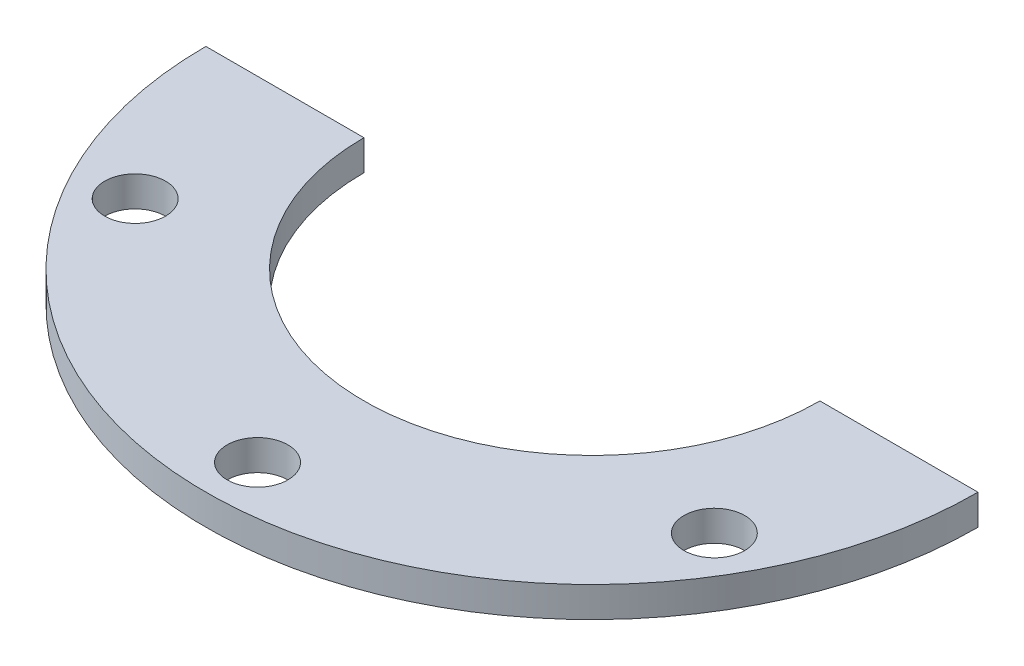
ISO-10303-21;
HEADER;
FILE_DESCRIPTION(('STEP AP214'),'2;1');
FILE_NAME('part.step','',(''),(''),'','','');
FILE_SCHEMA(('AUTOMOTIVE_DESIGN { 1 0 10303 214 1 1 1 1 }'));
ENDSEC;
DATA;
#1=APPLICATION_CONTEXT('core data for automotive mechanical design processes');
#2=APPLICATION_PROTOCOL_DEFINITION('international standard','automotive_design',2000,#1);
#3=PRODUCT_CONTEXT('',#1,'mechanical');
#4=PRODUCT('Part','Part','',(#3));
#5=PRODUCT_RELATED_PRODUCT_CATEGORY('part','',(#4));
#6=PRODUCT_DEFINITION_FORMATION('','',#4);
#7=PRODUCT_DEFINITION_CONTEXT('part definition',#1,'design');
#8=PRODUCT_DEFINITION('design','',#6,#7);
#9=PRODUCT_DEFINITION_SHAPE('','',#8);
#10=(LENGTH_UNIT() NAMED_UNIT(*) SI_UNIT(.MILLI.,.METRE.));
#11=(NAMED_UNIT(*) PLANE_ANGLE_UNIT() SI_UNIT($,.RADIAN.));
#12=(NAMED_UNIT(*) SI_UNIT($,.STERADIAN.) SOLID_ANGLE_UNIT());
#13=UNCERTAINTY_MEASURE_WITH_UNIT(LENGTH_MEASURE(1.E-05),#10,'distance_accuracy_value','');
#14=(GEOMETRIC_REPRESENTATION_CONTEXT(3) GLOBAL_UNCERTAINTY_ASSIGNED_CONTEXT((#13)) GLOBAL_UNIT_ASSIGNED_CONTEXT((#10,
#11,#12)) REPRESENTATION_CONTEXT('',''));
#15=CARTESIAN_POINT('',(0.,0.,0.));
#16=DIRECTION('',(0.,0.,1.));
#17=DIRECTION('',(1.,0.,0.));
#18=AXIS2_PLACEMENT_3D('',#15,#16,#17);
#19=CARTESIAN_POINT('',(0.,1.,0.));
#20=DIRECTION('',(0.,-1.,0.));
#21=DIRECTION('',(0.,0.,-1.));
#22=AXIS2_PLACEMENT_3D('',#19,#20,#21);
#23=CYLINDRICAL_SURFACE('',#22,12.7);
#24=CARTESIAN_POINT('',(0.,1.,0.));
#25=DIRECTION('',(0.,1.,0.));
#26=DIRECTION('',(0.,0.,1.));
#27=AXIS2_PLACEMENT_3D('',#24,#25,#26);
#28=CIRCLE('',#27,12.7);
#29=CARTESIAN_POINT('',(-12.7,1.,0.));
#30=VERTEX_POINT('',#29);
#31=CARTESIAN_POINT('',(12.7,1.,0.));
#32=VERTEX_POINT('',#31);
#33=EDGE_CURVE('E76',#30,#32,#28,.T.);
#34=ORIENTED_EDGE('',*,*,#33,.F.);
#35=DIRECTION('',(0.,-1.,0.));
#36=VECTOR('',#35,1.);
#37=CARTESIAN_POINT('',(-12.7,1.,0.));
#38=LINE('',#37,#36);
#39=CARTESIAN_POINT('',(-12.7,0.,0.));
#40=VERTEX_POINT('',#39);
#41=EDGE_CURVE('E118',#30,#40,#38,.T.);
#42=ORIENTED_EDGE('',*,*,#41,.T.);
#43=CARTESIAN_POINT('',(0.,0.,0.));
#44=DIRECTION('',(0.,1.,0.));
#45=DIRECTION('',(0.,0.,1.));
#46=AXIS2_PLACEMENT_3D('',#43,#44,#45);
#47=CIRCLE('',#46,12.7);
#48=CARTESIAN_POINT('',(12.7,0.,0.));
#49=VERTEX_POINT('',#48);
#50=EDGE_CURVE('E84',#40,#49,#47,.T.);
#51=ORIENTED_EDGE('',*,*,#50,.T.);
#52=DIRECTION('',(0.,-1.,0.));
#53=VECTOR('',#52,1.);
#54=CARTESIAN_POINT('',(12.7,1.,0.));
#55=LINE('',#54,#53);
#56=EDGE_CURVE('E88',#49,#32,#55,.F.);
#57=ORIENTED_EDGE('',*,*,#56,.T.);
#58=EDGE_LOOP('',(#34,#42,#51,#57));
#59=FACE_BOUND('',#58,.T.);
#60=ADVANCED_FACE('F32',(#59),#23,.T.);
#61=CARTESIAN_POINT('',(0.,1.,0.));
#62=DIRECTION('',(0.,1.,0.));
#63=DIRECTION('',(0.,0.,1.));
#64=AXIS2_PLACEMENT_3D('',#61,#62,#63);
#65=PLANE('',#64);
#66=DIRECTION('',(1.,0.,0.));
#67=VECTOR('',#66,1.);
#68=CARTESIAN_POINT('',(0.,1.,0.));
#69=LINE('',#68,#67);
#70=CARTESIAN_POINT('',(-7.5,1.,0.));
#71=VERTEX_POINT('',#70);
#72=EDGE_CURVE('E53',#30,#71,#69,.T.);
#73=ORIENTED_EDGE('',*,*,#72,.F.);
#74=ORIENTED_EDGE('',*,*,#33,.T.);
#75=CARTESIAN_POINT('',(7.5,1.,0.));
#76=VERTEX_POINT('',#75);
#77=EDGE_CURVE('E93',#76,#32,#69,.T.);
#78=ORIENTED_EDGE('',*,*,#77,.F.);
#79=CARTESIAN_POINT('',(0.,1.,0.));
#80=DIRECTION('',(0.,1.,0.));
#81=DIRECTION('',(0.,0.,1.));
#82=AXIS2_PLACEMENT_3D('',#79,#80,#81);
#83=CIRCLE('',#82,7.5);
#84=EDGE_CURVE('E87',#71,#76,#83,.T.);
#85=ORIENTED_EDGE('',*,*,#84,.F.);
#86=EDGE_LOOP('',(#73,#74,#78,#85));
#87=FACE_BOUND('',#86,.T.);
#88=CARTESIAN_POINT('',(-9.52627944162812,1.,5.50000000000041));
#89=DIRECTION('',(0.,1.,0.));
#90=DIRECTION('',(0.,0.,1.));
#91=AXIS2_PLACEMENT_3D('',#88,#89,#90);
#92=CIRCLE('',#91,0.999999999999829);
#93=CARTESIAN_POINT('',(-9.52627944162812,1.,6.50000000000024));
#94=VERTEX_POINT('',#93);
#95=EDGE_CURVE('E111',#94,#94,#92,.T.);
#96=ORIENTED_EDGE('',*,*,#95,.F.);
#97=EDGE_LOOP('',(#96));
#98=FACE_BOUND('',#97,.T.);
#99=CARTESIAN_POINT('',(9.35222188245208E-13,1.,11.));
#100=DIRECTION('',(0.,1.,0.));
#101=DIRECTION('',(0.,0.,1.));
#102=AXIS2_PLACEMENT_3D('',#99,#100,#101);
#103=CIRCLE('',#102,0.999999999999467);
#104=CARTESIAN_POINT('',(9.35222188245208E-13,1.,11.9999999999995));
#105=VERTEX_POINT('',#104);
#106=EDGE_CURVE('E108',#105,#105,#103,.T.);
#107=ORIENTED_EDGE('',*,*,#106,.F.);
#108=EDGE_LOOP('',(#107));
#109=FACE_BOUND('',#108,.T.);
#110=CARTESIAN_POINT('',(9.52627944162938,1.,5.49999999999958));
#111=DIRECTION('',(0.,1.,0.));
#112=DIRECTION('',(0.,0.,1.));
#113=AXIS2_PLACEMENT_3D('',#110,#111,#112);
#114=CIRCLE('',#113,0.999999999999871);
#115=CARTESIAN_POINT('',(9.52627944162938,1.,6.49999999999945));
#116=VERTEX_POINT('',#115);
#117=EDGE_CURVE('E103',#116,#116,#114,.T.);
#118=ORIENTED_EDGE('',*,*,#117,.F.);
#119=EDGE_LOOP('',(#118));
#120=FACE_BOUND('',#119,.T.);
#121=ADVANCED_FACE('F123',(#87,#98,#109,#120),#65,.T.);
#122=CARTESIAN_POINT('',(0.,0.,0.));
#123=DIRECTION('',(0.,1.,0.));
#124=DIRECTION('',(0.,0.,1.));
#125=AXIS2_PLACEMENT_3D('',#122,#123,#124);
#126=PLANE('',#125);
#127=ORIENTED_EDGE('',*,*,#50,.F.);
#128=DIRECTION('',(1.,0.,0.));
#129=VECTOR('',#128,1.);
#130=CARTESIAN_POINT('',(0.,0.,0.));
#131=LINE('',#130,#129);
#132=CARTESIAN_POINT('',(-7.5,0.,0.));
#133=VERTEX_POINT('',#132);
#134=EDGE_CURVE('E70',#40,#133,#131,.T.);
#135=ORIENTED_EDGE('',*,*,#134,.T.);
#136=CARTESIAN_POINT('',(0.,0.,0.));
#137=DIRECTION('',(0.,1.,0.));
#138=DIRECTION('',(0.,0.,1.));
#139=AXIS2_PLACEMENT_3D('',#136,#137,#138);
#140=CIRCLE('',#139,7.5);
#141=CARTESIAN_POINT('',(7.5,0.,0.));
#142=VERTEX_POINT('',#141);
#143=EDGE_CURVE('E82',#133,#142,#140,.T.);
#144=ORIENTED_EDGE('',*,*,#143,.T.);
#145=EDGE_CURVE('E46',#142,#49,#131,.T.);
#146=ORIENTED_EDGE('',*,*,#145,.T.);
#147=EDGE_LOOP('',(#127,#135,#144,#146));
#148=FACE_BOUND('',#147,.T.);
#149=CARTESIAN_POINT('',(-9.52627944162812,0.,5.50000000000041));
#150=DIRECTION('',(0.,1.,0.));
#151=DIRECTION('',(0.,0.,1.));
#152=AXIS2_PLACEMENT_3D('',#149,#150,#151);
#153=CIRCLE('',#152,0.999999999999829);
#154=CARTESIAN_POINT('',(-9.52627944162812,0.,6.50000000000024));
#155=VERTEX_POINT('',#154);
#156=EDGE_CURVE('E90',#155,#155,#153,.T.);
#157=ORIENTED_EDGE('',*,*,#156,.T.);
#158=EDGE_LOOP('',(#157));
#159=FACE_BOUND('',#158,.T.);
#160=CARTESIAN_POINT('',(9.35222188245208E-13,0.,11.));
#161=DIRECTION('',(0.,1.,0.));
#162=DIRECTION('',(0.,0.,1.));
#163=AXIS2_PLACEMENT_3D('',#160,#161,#162);
#164=CIRCLE('',#163,0.999999999999467);
#165=CARTESIAN_POINT('',(9.35222188245208E-13,0.,11.9999999999995));
#166=VERTEX_POINT('',#165);
#167=EDGE_CURVE('E99',#166,#166,#164,.T.);
#168=ORIENTED_EDGE('',*,*,#167,.T.);
#169=EDGE_LOOP('',(#168));
#170=FACE_BOUND('',#169,.T.);
#171=CARTESIAN_POINT('',(9.52627944162938,0.,5.49999999999958));
#172=DIRECTION('',(0.,1.,0.));
#173=DIRECTION('',(0.,0.,1.));
#174=AXIS2_PLACEMENT_3D('',#171,#172,#173);
#175=CIRCLE('',#174,0.999999999999871);
#176=CARTESIAN_POINT('',(9.52627944162938,0.,6.49999999999945));
#177=VERTEX_POINT('',#176);
#178=EDGE_CURVE('E100',#177,#177,#175,.T.);
#179=ORIENTED_EDGE('',*,*,#178,.T.);
#180=EDGE_LOOP('',(#179));
#181=FACE_BOUND('',#180,.T.);
#182=ADVANCED_FACE('F80',(#148,#159,#170,#181),#126,.F.);
#183=CARTESIAN_POINT('',(9.52627944162938,0.,5.49999999999958));
#184=DIRECTION('',(0.,1.,0.));
#185=DIRECTION('',(0.,0.,1.));
#186=AXIS2_PLACEMENT_3D('',#183,#184,#185);
#187=CYLINDRICAL_SURFACE('',#186,0.999999999999871);
#188=ORIENTED_EDGE('',*,*,#117,.T.);
#189=EDGE_LOOP('',(#188));
#190=FACE_BOUND('',#189,.T.);
#191=ORIENTED_EDGE('',*,*,#178,.F.);
#192=EDGE_LOOP('',(#191));
#193=FACE_BOUND('',#192,.T.);
#194=ADVANCED_FACE('F133',(#190,#193),#187,.F.);
#195=CARTESIAN_POINT('',(9.35222188245208E-13,0.,11.));
#196=DIRECTION('',(0.,1.,0.));
#197=DIRECTION('',(0.,0.,1.));
#198=AXIS2_PLACEMENT_3D('',#195,#196,#197);
#199=CYLINDRICAL_SURFACE('',#198,0.999999999999467);
#200=ORIENTED_EDGE('',*,*,#106,.T.);
#201=EDGE_LOOP('',(#200));
#202=FACE_BOUND('',#201,.T.);
#203=ORIENTED_EDGE('',*,*,#167,.F.);
#204=EDGE_LOOP('',(#203));
#205=FACE_BOUND('',#204,.T.);
#206=ADVANCED_FACE('F136',(#202,#205),#199,.F.);
#207=CARTESIAN_POINT('',(-9.52627944162812,0.,5.50000000000041));
#208=DIRECTION('',(0.,1.,0.));
#209=DIRECTION('',(0.,0.,1.));
#210=AXIS2_PLACEMENT_3D('',#207,#208,#209);
#211=CYLINDRICAL_SURFACE('',#210,0.999999999999829);
#212=ORIENTED_EDGE('',*,*,#95,.T.);
#213=EDGE_LOOP('',(#212));
#214=FACE_BOUND('',#213,.T.);
#215=ORIENTED_EDGE('',*,*,#156,.F.);
#216=EDGE_LOOP('',(#215));
#217=FACE_BOUND('',#216,.T.);
#218=ADVANCED_FACE('F165',(#214,#217),#211,.F.);
#219=CARTESIAN_POINT('',(0.,0.,0.));
#220=DIRECTION('',(0.,1.,0.));
#221=DIRECTION('',(0.,0.,1.));
#222=AXIS2_PLACEMENT_3D('',#219,#220,#221);
#223=CYLINDRICAL_SURFACE('',#222,7.5);
#224=ORIENTED_EDGE('',*,*,#84,.T.);
#225=DIRECTION('',(0.,1.,0.));
#226=VECTOR('',#225,1.);
#227=CARTESIAN_POINT('',(7.5,0.,0.));
#228=LINE('',#227,#226);
#229=EDGE_CURVE('E11',#76,#142,#228,.F.);
#230=ORIENTED_EDGE('',*,*,#229,.T.);
#231=ORIENTED_EDGE('',*,*,#143,.F.);
#232=DIRECTION('',(0.,1.,0.));
#233=VECTOR('',#232,1.);
#234=CARTESIAN_POINT('',(-7.5,0.,0.));
#235=LINE('',#234,#233);
#236=EDGE_CURVE('E39',#133,#71,#235,.T.);
#237=ORIENTED_EDGE('',*,*,#236,.T.);
#238=EDGE_LOOP('',(#224,#230,#231,#237));
#239=FACE_BOUND('',#238,.T.);
#240=ADVANCED_FACE('F86',(#239),#223,.F.);
#241=CARTESIAN_POINT('',(0.,0.,0.));
#242=DIRECTION('',(0.,0.,1.));
#243=DIRECTION('',(1.,0.,0.));
#244=AXIS2_PLACEMENT_3D('',#241,#242,#243);
#245=PLANE('',#244);
#246=ORIENTED_EDGE('',*,*,#72,.T.);
#247=ORIENTED_EDGE('',*,*,#236,.F.);
#248=ORIENTED_EDGE('',*,*,#134,.F.);
#249=ORIENTED_EDGE('',*,*,#41,.F.);
#250=EDGE_LOOP('',(#246,#247,#248,#249));
#251=FACE_BOUND('',#250,.T.);
#252=ADVANCED_FACE('F69',(#251),#245,.F.);
#253=ORIENTED_EDGE('',*,*,#145,.F.);
#254=ORIENTED_EDGE('',*,*,#229,.F.);
#255=ORIENTED_EDGE('',*,*,#77,.T.);
#256=ORIENTED_EDGE('',*,*,#56,.F.);
#257=EDGE_LOOP('',(#253,#254,#255,#256));
#258=FACE_BOUND('',#257,.T.);
#259=ADVANCED_FACE('F121',(#258),#245,.F.);
#260=CLOSED_SHELL('',(#60,#121,#182,#194,#206,#218,#240,#252,#259));
#261=MANIFOLD_SOLID_BREP('B2',#260);
#262=ADVANCED_BREP_SHAPE_REPRESENTATION('',(#18,#261),#14);
#263=SHAPE_DEFINITION_REPRESENTATION(#9,#262);
ENDSEC;
END-ISO-10303-21;
